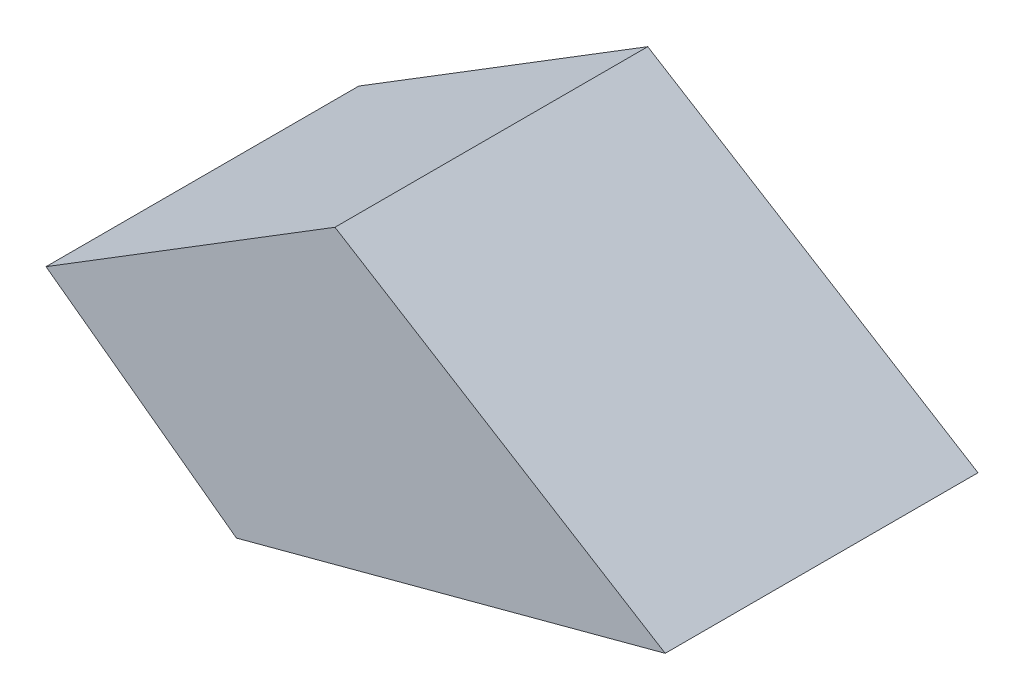
ISO-10303-21;
HEADER;
FILE_DESCRIPTION(('STEP AP214'),'2;1');
FILE_NAME('part.step','',(''),(''),'','','');
FILE_SCHEMA(('AUTOMOTIVE_DESIGN { 1 0 10303 214 1 1 1 1 }'));
ENDSEC;
DATA;
#1=APPLICATION_CONTEXT('core data for automotive mechanical design processes');
#2=APPLICATION_PROTOCOL_DEFINITION('international standard','automotive_design',2000,#1);
#3=PRODUCT_CONTEXT('',#1,'mechanical');
#4=PRODUCT('Part','Part','',(#3));
#5=PRODUCT_RELATED_PRODUCT_CATEGORY('part','',(#4));
#6=PRODUCT_DEFINITION_FORMATION('','',#4);
#7=PRODUCT_DEFINITION_CONTEXT('part definition',#1,'design');
#8=PRODUCT_DEFINITION('design','',#6,#7);
#9=PRODUCT_DEFINITION_SHAPE('','',#8);
#10=(LENGTH_UNIT() NAMED_UNIT(*) SI_UNIT(.MILLI.,.METRE.));
#11=(NAMED_UNIT(*) PLANE_ANGLE_UNIT() SI_UNIT($,.RADIAN.));
#12=(NAMED_UNIT(*) SI_UNIT($,.STERADIAN.) SOLID_ANGLE_UNIT());
#13=UNCERTAINTY_MEASURE_WITH_UNIT(LENGTH_MEASURE(1.E-05),#10,'distance_accuracy_value','');
#14=(GEOMETRIC_REPRESENTATION_CONTEXT(3) GLOBAL_UNCERTAINTY_ASSIGNED_CONTEXT((#13)) GLOBAL_UNIT_ASSIGNED_CONTEXT((#10,
#11,#12)) REPRESENTATION_CONTEXT('',''));
#15=CARTESIAN_POINT('',(0.,0.,0.));
#16=DIRECTION('',(0.,0.,1.));
#17=DIRECTION('',(1.,0.,0.));
#18=AXIS2_PLACEMENT_3D('',#15,#16,#17);
#19=CARTESIAN_POINT('',(-16.1454192625263,-32.8381408729348,-101.6));
#20=DIRECTION('',(-0.591981898296969,-0.805951259127199,0.));
#21=DIRECTION('',(0.805951259127199,-0.591981898296969,0.));
#22=AXIS2_PLACEMENT_3D('',#19,#20,#21);
#23=PLANE('',#22);
#24=DIRECTION('',(0.805951259127199,-0.591981898296969,0.));
#25=VECTOR('',#24,1.);
#26=CARTESIAN_POINT('',(-16.1454192625263,-32.8381408729348,0.));
#27=LINE('',#26,#25);
#28=CARTESIAN_POINT('',(-77.9905845732203,12.5879540012917,0.));
#29=VERTEX_POINT('',#28);
#30=CARTESIAN_POINT('',(-16.1454192625263,-32.8381408729348,0.));
#31=VERTEX_POINT('',#30);
#32=EDGE_CURVE('E97',#29,#31,#27,.T.);
#33=ORIENTED_EDGE('',*,*,#32,.F.);
#34=DIRECTION('',(0.,0.,1.));
#35=VECTOR('',#34,1.);
#36=CARTESIAN_POINT('',(-77.9905845732203,12.5879540012917,-101.6));
#37=LINE('',#36,#35);
#38=CARTESIAN_POINT('',(-77.9905845732203,12.5879540012917,-101.6));
#39=VERTEX_POINT('',#38);
#40=EDGE_CURVE('E11',#39,#29,#37,.T.);
#41=ORIENTED_EDGE('',*,*,#40,.F.);
#42=DIRECTION('',(0.805951259127199,-0.591981898296969,0.));
#43=VECTOR('',#42,1.);
#44=CARTESIAN_POINT('',(-16.1454192625263,-32.8381408729348,-101.6));
#45=LINE('',#44,#43);
#46=CARTESIAN_POINT('',(-16.1454192625263,-32.8381408729348,-101.6));
#47=VERTEX_POINT('',#46);
#48=EDGE_CURVE('E91',#39,#47,#45,.T.);
#49=ORIENTED_EDGE('',*,*,#48,.T.);
#50=DIRECTION('',(0.,0.,1.));
#51=VECTOR('',#50,1.);
#52=CARTESIAN_POINT('',(-16.1454192625263,-32.8381408729348,-101.6));
#53=LINE('',#52,#51);
#54=EDGE_CURVE('E36',#47,#31,#53,.T.);
#55=ORIENTED_EDGE('',*,*,#54,.T.);
#56=EDGE_LOOP('',(#33,#41,#49,#55));
#57=FACE_BOUND('',#56,.T.);
#58=ADVANCED_FACE('F33',(#57),#23,.T.);
#59=CARTESIAN_POINT('',(-77.9905845732203,12.5879540012917,-101.6));
#60=DIRECTION('',(-0.525756848833194,0.850634901649932,0.));
#61=DIRECTION('',(-0.850634901649932,-0.525756848833194,0.));
#62=AXIS2_PLACEMENT_3D('',#59,#60,#61);
#63=PLANE('',#62);
#64=DIRECTION('',(-0.850634901649932,-0.525756848833194,0.));
#65=VECTOR('',#64,1.);
#66=CARTESIAN_POINT('',(-77.9905845732203,12.5879540012917,0.));
#67=LINE('',#66,#65);
#68=CARTESIAN_POINT('',(15.8717680885851,70.6020028768099,0.));
#69=VERTEX_POINT('',#68);
#70=EDGE_CURVE('E93',#69,#29,#67,.T.);
#71=ORIENTED_EDGE('',*,*,#70,.F.);
#72=DIRECTION('',(0.,0.,1.));
#73=VECTOR('',#72,1.);
#74=CARTESIAN_POINT('',(15.8717680885851,70.6020028768099,-101.6));
#75=LINE('',#74,#73);
#76=CARTESIAN_POINT('',(15.8717680885851,70.6020028768099,-101.6));
#77=VERTEX_POINT('',#76);
#78=EDGE_CURVE('E42',#77,#69,#75,.T.);
#79=ORIENTED_EDGE('',*,*,#78,.F.);
#80=DIRECTION('',(-0.850634901649932,-0.525756848833194,0.));
#81=VECTOR('',#80,1.);
#82=CARTESIAN_POINT('',(-77.9905845732203,12.5879540012917,-101.6));
#83=LINE('',#82,#81);
#84=EDGE_CURVE('E88',#77,#39,#83,.T.);
#85=ORIENTED_EDGE('',*,*,#84,.T.);
#86=ORIENTED_EDGE('',*,*,#40,.T.);
#87=EDGE_LOOP('',(#71,#79,#85,#86));
#88=FACE_BOUND('',#87,.T.);
#89=ADVANCED_FACE('F107',(#88),#63,.T.);
#90=CARTESIAN_POINT('',(15.8717680885851,70.6020028768099,-101.6));
#91=DIRECTION('',(0.525308012701266,0.850912152805356,0.));
#92=DIRECTION('',(-0.850912152805357,0.525308012701266,0.));
#93=AXIS2_PLACEMENT_3D('',#90,#91,#92);
#94=PLANE('',#93);
#95=DIRECTION('',(-0.850912152805356,0.525308012701266,0.));
#96=VECTOR('',#95,1.);
#97=CARTESIAN_POINT('',(15.8717680885851,70.6020028768099,0.));
#98=LINE('',#97,#96);
#99=CARTESIAN_POINT('',(123.143028273506,4.37841878305797,0.));
#100=VERTEX_POINT('',#99);
#101=EDGE_CURVE('E83',#100,#69,#98,.T.);
#102=ORIENTED_EDGE('',*,*,#101,.F.);
#103=DIRECTION('',(0.,0.,1.));
#104=VECTOR('',#103,1.);
#105=CARTESIAN_POINT('',(123.143028273506,4.37841878305797,-101.6));
#106=LINE('',#105,#104);
#107=CARTESIAN_POINT('',(123.143028273506,4.37841878305797,-101.6));
#108=VERTEX_POINT('',#107);
#109=EDGE_CURVE('E78',#108,#100,#106,.T.);
#110=ORIENTED_EDGE('',*,*,#109,.F.);
#111=DIRECTION('',(-0.850912152805356,0.525308012701266,0.));
#112=VECTOR('',#111,1.);
#113=CARTESIAN_POINT('',(15.8717680885851,70.6020028768099,-101.6));
#114=LINE('',#113,#112);
#115=EDGE_CURVE('E81',#108,#77,#114,.T.);
#116=ORIENTED_EDGE('',*,*,#115,.T.);
#117=ORIENTED_EDGE('',*,*,#78,.T.);
#118=EDGE_LOOP('',(#102,#110,#116,#117));
#119=FACE_BOUND('',#118,.T.);
#120=ADVANCED_FACE('F80',(#119),#94,.T.);
#121=CARTESIAN_POINT('',(123.143028273506,4.37841878305797,-101.6));
#122=DIRECTION('',(0.258135163981609,-0.9661088122547,0.));
#123=DIRECTION('',(0.9661088122547,0.258135163981609,0.));
#124=AXIS2_PLACEMENT_3D('',#121,#122,#123);
#125=PLANE('',#124);
#126=DIRECTION('',(0.9661088122547,0.258135163981609,0.));
#127=VECTOR('',#126,1.);
#128=CARTESIAN_POINT('',(123.143028273506,4.37841878305797,0.));
#129=LINE('',#128,#127);
#130=EDGE_CURVE('E100',#31,#100,#129,.T.);
#131=ORIENTED_EDGE('',*,*,#130,.F.);
#132=ORIENTED_EDGE('',*,*,#54,.F.);
#133=DIRECTION('',(0.9661088122547,0.258135163981609,0.));
#134=VECTOR('',#133,1.);
#135=CARTESIAN_POINT('',(123.143028273506,4.37841878305797,-101.6));
#136=LINE('',#135,#134);
#137=EDGE_CURVE('E87',#47,#108,#136,.T.);
#138=ORIENTED_EDGE('',*,*,#137,.T.);
#139=ORIENTED_EDGE('',*,*,#109,.T.);
#140=EDGE_LOOP('',(#131,#132,#138,#139));
#141=FACE_BOUND('',#140,.T.);
#142=ADVANCED_FACE('F90',(#141),#125,.T.);
#143=CARTESIAN_POINT('',(0.,0.,-101.6));
#144=DIRECTION('',(0.,0.,-1.));
#145=DIRECTION('',(-1.,0.,0.));
#146=AXIS2_PLACEMENT_3D('',#143,#144,#145);
#147=PLANE('',#146);
#148=ORIENTED_EDGE('',*,*,#48,.F.);
#149=ORIENTED_EDGE('',*,*,#84,.F.);
#150=ORIENTED_EDGE('',*,*,#115,.F.);
#151=ORIENTED_EDGE('',*,*,#137,.F.);
#152=EDGE_LOOP('',(#148,#149,#150,#151));
#153=FACE_BOUND('',#152,.T.);
#154=ADVANCED_FACE('F86',(#153),#147,.T.);
#155=CARTESIAN_POINT('',(0.,0.,0.));
#156=DIRECTION('',(0.,0.,-1.));
#157=DIRECTION('',(-1.,0.,0.));
#158=AXIS2_PLACEMENT_3D('',#155,#156,#157);
#159=PLANE('',#158);
#160=ORIENTED_EDGE('',*,*,#32,.T.);
#161=ORIENTED_EDGE('',*,*,#130,.T.);
#162=ORIENTED_EDGE('',*,*,#101,.T.);
#163=ORIENTED_EDGE('',*,*,#70,.T.);
#164=EDGE_LOOP('',(#160,#161,#162,#163));
#165=FACE_BOUND('',#164,.T.);
#166=ADVANCED_FACE('F106',(#165),#159,.F.);
#167=CLOSED_SHELL('',(#58,#89,#120,#142,#154,#166));
#168=MANIFOLD_SOLID_BREP('B2',#167);
#169=ADVANCED_BREP_SHAPE_REPRESENTATION('',(#18,#168),#14);
#170=SHAPE_DEFINITION_REPRESENTATION(#9,#169);
ENDSEC;
END-ISO-10303-21;
